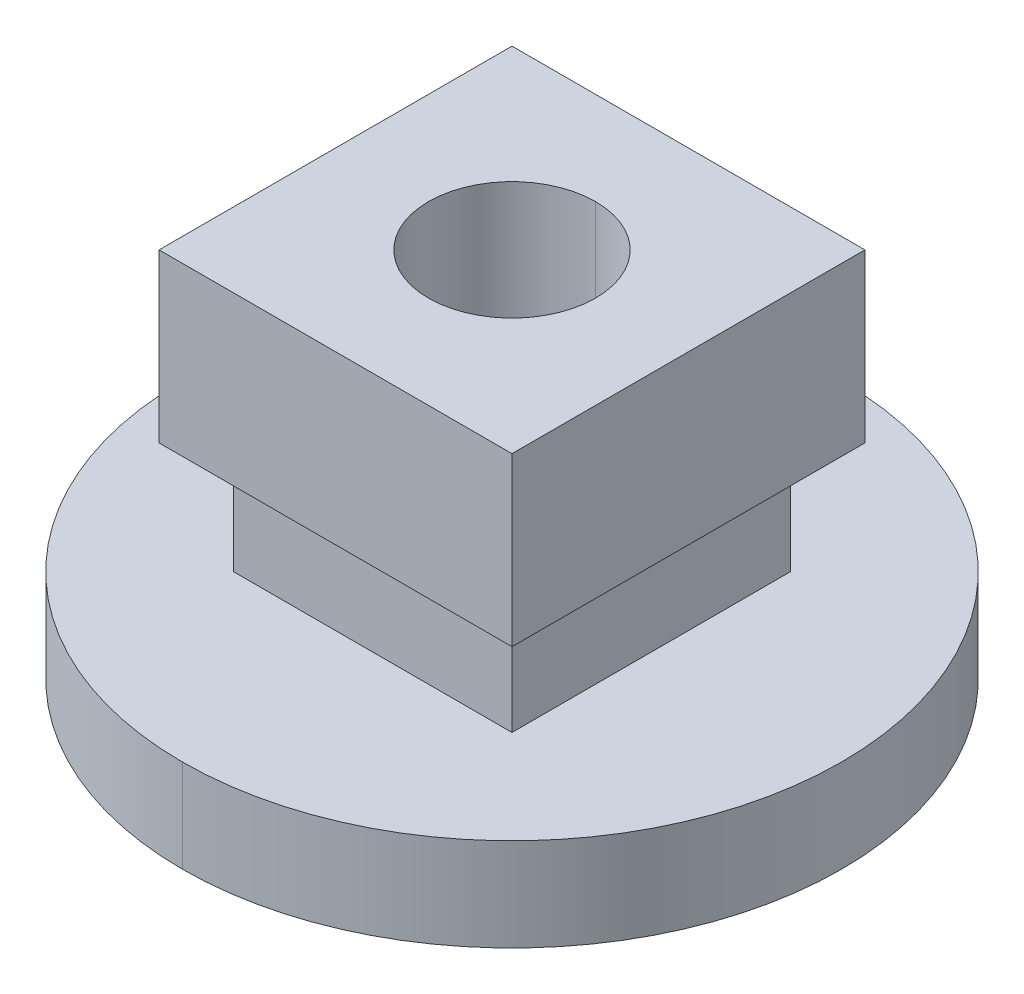
ISO-10303-21;
HEADER;
FILE_DESCRIPTION(('STEP AP214'),'2;1');
FILE_NAME('part.step','',(''),(''),'','','');
FILE_SCHEMA(('AUTOMOTIVE_DESIGN { 1 0 10303 214 1 1 1 1 }'));
ENDSEC;
DATA;
#1=APPLICATION_CONTEXT('core data for automotive mechanical design processes');
#2=APPLICATION_PROTOCOL_DEFINITION('international standard','automotive_design',2000,#1);
#3=PRODUCT_CONTEXT('',#1,'mechanical');
#4=PRODUCT('Part','Part','',(#3));
#5=PRODUCT_RELATED_PRODUCT_CATEGORY('part','',(#4));
#6=PRODUCT_DEFINITION_FORMATION('','',#4);
#7=PRODUCT_DEFINITION_CONTEXT('part definition',#1,'design');
#8=PRODUCT_DEFINITION('design','',#6,#7);
#9=PRODUCT_DEFINITION_SHAPE('','',#8);
#10=(LENGTH_UNIT() NAMED_UNIT(*) SI_UNIT(.MILLI.,.METRE.));
#11=(NAMED_UNIT(*) PLANE_ANGLE_UNIT() SI_UNIT($,.RADIAN.));
#12=(NAMED_UNIT(*) SI_UNIT($,.STERADIAN.) SOLID_ANGLE_UNIT());
#13=UNCERTAINTY_MEASURE_WITH_UNIT(LENGTH_MEASURE(1.E-05),#10,'distance_accuracy_value','');
#14=(GEOMETRIC_REPRESENTATION_CONTEXT(3) GLOBAL_UNCERTAINTY_ASSIGNED_CONTEXT((#13)) GLOBAL_UNIT_ASSIGNED_CONTEXT((#10,
#11,#12)) REPRESENTATION_CONTEXT('',''));
#15=CARTESIAN_POINT('',(0.,0.,0.));
#16=DIRECTION('',(0.,0.,1.));
#17=DIRECTION('',(1.,0.,0.));
#18=AXIS2_PLACEMENT_3D('',#15,#16,#17);
#19=CARTESIAN_POINT('',(0.,-4.,0.));
#20=DIRECTION('',(0.,-1.,0.));
#21=DIRECTION('',(0.,0.,-1.));
#22=AXIS2_PLACEMENT_3D('',#19,#20,#21);
#23=PLANE('',#22);
#24=CARTESIAN_POINT('',(0.,-4.,0.));
#25=DIRECTION('',(0.,-1.,0.));
#26=DIRECTION('',(0.,0.,-1.));
#27=AXIS2_PLACEMENT_3D('',#24,#25,#26);
#28=CIRCLE('',#27,3.55);
#29=CARTESIAN_POINT('',(0.,-4.,3.55));
#30=VERTEX_POINT('',#29);
#31=CARTESIAN_POINT('',(0.,-4.,-3.55));
#32=VERTEX_POINT('',#31);
#33=EDGE_CURVE('E11',#30,#32,#28,.T.);
#34=ORIENTED_EDGE('',*,*,#33,.T.);
#35=CARTESIAN_POINT('',(0.,-4.,0.));
#36=DIRECTION('',(0.,-1.,0.));
#37=DIRECTION('',(0.,0.,-1.));
#38=AXIS2_PLACEMENT_3D('',#35,#36,#37);
#39=CIRCLE('',#38,3.55);
#40=EDGE_CURVE('E205',#32,#30,#39,.T.);
#41=ORIENTED_EDGE('',*,*,#40,.T.);
#42=EDGE_LOOP('',(#34,#41));
#43=FACE_BOUND('',#42,.T.);
#44=ADVANCED_FACE('F17',(#43),#23,.T.);
#45=CARTESIAN_POINT('',(0.,-4.,0.));
#46=DIRECTION('',(0.,1.,0.));
#47=DIRECTION('',(0.,0.,1.));
#48=AXIS2_PLACEMENT_3D('',#45,#46,#47);
#49=CYLINDRICAL_SURFACE('',#48,3.55);
#50=DIRECTION('',(0.,1.,0.));
#51=VECTOR('',#50,1.);
#52=CARTESIAN_POINT('',(0.,-4.,-3.55));
#53=LINE('',#52,#51);
#54=CARTESIAN_POINT('',(0.,-3.,-3.55));
#55=VERTEX_POINT('',#54);
#56=EDGE_CURVE('E202',#32,#55,#53,.T.);
#57=ORIENTED_EDGE('',*,*,#56,.F.);
#58=ORIENTED_EDGE('',*,*,#33,.F.);
#59=DIRECTION('',(0.,1.,0.));
#60=VECTOR('',#59,1.);
#61=CARTESIAN_POINT('',(0.,-4.,3.55));
#62=LINE('',#61,#60);
#63=CARTESIAN_POINT('',(0.,-3.,3.55));
#64=VERTEX_POINT('',#63);
#65=EDGE_CURVE('E25',#30,#64,#62,.T.);
#66=ORIENTED_EDGE('',*,*,#65,.T.);
#67=CARTESIAN_POINT('',(0.,-3.,0.));
#68=DIRECTION('',(0.,-1.,0.));
#69=DIRECTION('',(0.,0.,-1.));
#70=AXIS2_PLACEMENT_3D('',#67,#68,#69);
#71=CIRCLE('',#70,3.55);
#72=EDGE_CURVE('E191',#64,#55,#71,.T.);
#73=ORIENTED_EDGE('',*,*,#72,.T.);
#74=EDGE_LOOP('',(#57,#58,#66,#73));
#75=FACE_BOUND('',#74,.T.);
#76=ADVANCED_FACE('F209',(#75),#49,.T.);
#77=CARTESIAN_POINT('',(0.,-4.,0.));
#78=DIRECTION('',(0.,1.,0.));
#79=DIRECTION('',(0.,0.,1.));
#80=AXIS2_PLACEMENT_3D('',#77,#78,#79);
#81=CYLINDRICAL_SURFACE('',#80,3.55);
#82=ORIENTED_EDGE('',*,*,#40,.F.);
#83=ORIENTED_EDGE('',*,*,#56,.T.);
#84=CARTESIAN_POINT('',(0.,-3.,0.));
#85=DIRECTION('',(0.,-1.,0.));
#86=DIRECTION('',(0.,0.,-1.));
#87=AXIS2_PLACEMENT_3D('',#84,#85,#86);
#88=CIRCLE('',#87,3.55);
#89=EDGE_CURVE('E196',#55,#64,#88,.T.);
#90=ORIENTED_EDGE('',*,*,#89,.T.);
#91=ORIENTED_EDGE('',*,*,#65,.F.);
#92=EDGE_LOOP('',(#82,#83,#90,#91));
#93=FACE_BOUND('',#92,.T.);
#94=ADVANCED_FACE('F214',(#93),#81,.T.);
#95=CARTESIAN_POINT('',(0.,-1.8,0.));
#96=DIRECTION('',(0.,1.,0.));
#97=DIRECTION('',(1.,0.,0.));
#98=AXIS2_PLACEMENT_3D('',#95,#96,#97);
#99=PLANE('',#98);
#100=CARTESIAN_POINT('',(0.,-1.8,0.));
#101=DIRECTION('',(0.,1.,0.));
#102=DIRECTION('',(0.,0.,1.));
#103=AXIS2_PLACEMENT_3D('',#100,#101,#102);
#104=CIRCLE('',#103,0.9);
#105=CARTESIAN_POINT('',(0.,-1.8,0.9));
#106=VERTEX_POINT('',#105);
#107=CARTESIAN_POINT('',(0.,-1.8,-0.9));
#108=VERTEX_POINT('',#107);
#109=EDGE_CURVE('E190',#106,#108,#104,.T.);
#110=ORIENTED_EDGE('',*,*,#109,.T.);
#111=CARTESIAN_POINT('',(0.,-1.8,0.));
#112=DIRECTION('',(0.,1.,0.));
#113=DIRECTION('',(0.,0.,1.));
#114=AXIS2_PLACEMENT_3D('',#111,#112,#113);
#115=CIRCLE('',#114,0.9);
#116=EDGE_CURVE('E192',#108,#106,#115,.T.);
#117=ORIENTED_EDGE('',*,*,#116,.T.);
#118=EDGE_LOOP('',(#110,#117));
#119=FACE_BOUND('',#118,.T.);
#120=ADVANCED_FACE('F217',(#119),#99,.T.);
#121=CARTESIAN_POINT('',(0.,-3.,0.));
#122=DIRECTION('',(0.,-1.,0.));
#123=DIRECTION('',(0.,0.,-1.));
#124=AXIS2_PLACEMENT_3D('',#121,#122,#123);
#125=PLANE('',#124);
#126=DIRECTION('',(1.,0.,0.));
#127=VECTOR('',#126,1.);
#128=CARTESIAN_POINT('',(1.5,-3.,-1.5));
#129=LINE('',#128,#127);
#130=CARTESIAN_POINT('',(-1.5,-3.,-1.5));
#131=VERTEX_POINT('',#130);
#132=CARTESIAN_POINT('',(1.5,-3.,-1.5));
#133=VERTEX_POINT('',#132);
#134=EDGE_CURVE('E146',#131,#133,#129,.T.);
#135=ORIENTED_EDGE('',*,*,#134,.T.);
#136=DIRECTION('',(0.,0.,1.));
#137=VECTOR('',#136,1.);
#138=CARTESIAN_POINT('',(1.5,-3.,1.5));
#139=LINE('',#138,#137);
#140=CARTESIAN_POINT('',(1.5,-3.,1.5));
#141=VERTEX_POINT('',#140);
#142=EDGE_CURVE('E133',#133,#141,#139,.T.);
#143=ORIENTED_EDGE('',*,*,#142,.T.);
#144=DIRECTION('',(-1.,0.,0.));
#145=VECTOR('',#144,1.);
#146=CARTESIAN_POINT('',(1.5,-3.,1.5));
#147=LINE('',#146,#145);
#148=CARTESIAN_POINT('',(-1.5,-3.,1.5));
#149=VERTEX_POINT('',#148);
#150=EDGE_CURVE('E179',#141,#149,#147,.T.);
#151=ORIENTED_EDGE('',*,*,#150,.T.);
#152=DIRECTION('',(0.,0.,-1.));
#153=VECTOR('',#152,1.);
#154=CARTESIAN_POINT('',(-1.5,-3.,1.5));
#155=LINE('',#154,#153);
#156=EDGE_CURVE('E155',#149,#131,#155,.T.);
#157=ORIENTED_EDGE('',*,*,#156,.T.);
#158=EDGE_LOOP('',(#135,#143,#151,#157));
#159=FACE_BOUND('',#158,.T.);
#160=ORIENTED_EDGE('',*,*,#72,.F.);
#161=ORIENTED_EDGE('',*,*,#89,.F.);
#162=EDGE_LOOP('',(#160,#161));
#163=FACE_BOUND('',#162,.T.);
#164=ADVANCED_FACE('F149',(#159,#163),#125,.F.);
#165=CARTESIAN_POINT('',(0.,-1.8,0.));
#166=DIRECTION('',(0.,1.,0.));
#167=DIRECTION('',(0.,0.,1.));
#168=AXIS2_PLACEMENT_3D('',#165,#166,#167);
#169=CYLINDRICAL_SURFACE('',#168,0.9);
#170=ORIENTED_EDGE('',*,*,#116,.F.);
#171=DIRECTION('',(0.,1.,0.));
#172=VECTOR('',#171,1.);
#173=CARTESIAN_POINT('',(0.,-1.8,-0.9));
#174=LINE('',#173,#172);
#175=CARTESIAN_POINT('',(0.,0.,-0.9));
#176=VERTEX_POINT('',#175);
#177=EDGE_CURVE('E144',#108,#176,#174,.T.);
#178=ORIENTED_EDGE('',*,*,#177,.T.);
#179=CARTESIAN_POINT('',(0.,0.,0.));
#180=DIRECTION('',(0.,1.,0.));
#181=DIRECTION('',(0.,0.,1.));
#182=AXIS2_PLACEMENT_3D('',#179,#180,#181);
#183=CIRCLE('',#182,0.9);
#184=CARTESIAN_POINT('',(0.,0.,0.9));
#185=VERTEX_POINT('',#184);
#186=EDGE_CURVE('E162',#176,#185,#183,.T.);
#187=ORIENTED_EDGE('',*,*,#186,.T.);
#188=DIRECTION('',(0.,1.,0.));
#189=VECTOR('',#188,1.);
#190=CARTESIAN_POINT('',(0.,-1.8,0.9));
#191=LINE('',#190,#189);
#192=EDGE_CURVE('E174',#106,#185,#191,.T.);
#193=ORIENTED_EDGE('',*,*,#192,.F.);
#194=EDGE_LOOP('',(#170,#178,#187,#193));
#195=FACE_BOUND('',#194,.T.);
#196=ADVANCED_FACE('F220',(#195),#169,.F.);
#197=CARTESIAN_POINT('',(0.,-1.8,0.));
#198=DIRECTION('',(0.,1.,0.));
#199=DIRECTION('',(0.,0.,1.));
#200=AXIS2_PLACEMENT_3D('',#197,#198,#199);
#201=CYLINDRICAL_SURFACE('',#200,0.9);
#202=ORIENTED_EDGE('',*,*,#177,.F.);
#203=ORIENTED_EDGE('',*,*,#109,.F.);
#204=ORIENTED_EDGE('',*,*,#192,.T.);
#205=CARTESIAN_POINT('',(0.,0.,0.));
#206=DIRECTION('',(0.,1.,0.));
#207=DIRECTION('',(0.,0.,1.));
#208=AXIS2_PLACEMENT_3D('',#205,#206,#207);
#209=CIRCLE('',#208,0.9);
#210=EDGE_CURVE('E168',#185,#176,#209,.T.);
#211=ORIENTED_EDGE('',*,*,#210,.T.);
#212=EDGE_LOOP('',(#202,#203,#204,#211));
#213=FACE_BOUND('',#212,.T.);
#214=ADVANCED_FACE('F226',(#213),#201,.F.);
#215=CARTESIAN_POINT('',(1.5,-3.,1.5));
#216=DIRECTION('',(-1.,0.,0.));
#217=DIRECTION('',(0.,0.,1.));
#218=AXIS2_PLACEMENT_3D('',#215,#216,#217);
#219=PLANE('',#218);
#220=DIRECTION('',(0.,0.,1.));
#221=VECTOR('',#220,1.);
#222=CARTESIAN_POINT('',(1.5,-1.8,1.5));
#223=LINE('',#222,#221);
#224=CARTESIAN_POINT('',(1.5,-1.8,-1.5));
#225=VERTEX_POINT('',#224);
#226=CARTESIAN_POINT('',(1.5,-1.8,1.5));
#227=VERTEX_POINT('',#226);
#228=EDGE_CURVE('E276',#225,#227,#223,.T.);
#229=ORIENTED_EDGE('',*,*,#228,.T.);
#230=DIRECTION('',(0.,1.,0.));
#231=VECTOR('',#230,1.);
#232=CARTESIAN_POINT('',(1.5,-3.,1.5));
#233=LINE('',#232,#231);
#234=EDGE_CURVE('E143',#141,#227,#233,.T.);
#235=ORIENTED_EDGE('',*,*,#234,.F.);
#236=ORIENTED_EDGE('',*,*,#142,.F.);
#237=DIRECTION('',(0.,1.,0.));
#238=VECTOR('',#237,1.);
#239=CARTESIAN_POINT('',(1.5,-3.,-1.5));
#240=LINE('',#239,#238);
#241=EDGE_CURVE('E136',#133,#225,#240,.T.);
#242=ORIENTED_EDGE('',*,*,#241,.T.);
#243=EDGE_LOOP('',(#229,#235,#236,#242));
#244=FACE_BOUND('',#243,.T.);
#245=ADVANCED_FACE('F140',(#244),#219,.F.);
#246=CARTESIAN_POINT('',(1.5,-3.,1.5));
#247=DIRECTION('',(0.,0.,-1.));
#248=DIRECTION('',(0.,-1.,0.));
#249=AXIS2_PLACEMENT_3D('',#246,#247,#248);
#250=PLANE('',#249);
#251=DIRECTION('',(-1.,0.,0.));
#252=VECTOR('',#251,1.);
#253=CARTESIAN_POINT('',(1.5,-1.8,1.5));
#254=LINE('',#253,#252);
#255=CARTESIAN_POINT('',(-1.5,-1.8,1.5));
#256=VERTEX_POINT('',#255);
#257=EDGE_CURVE('E263',#227,#256,#254,.T.);
#258=ORIENTED_EDGE('',*,*,#257,.T.);
#259=DIRECTION('',(0.,1.,0.));
#260=VECTOR('',#259,1.);
#261=CARTESIAN_POINT('',(-1.5,-3.,1.5));
#262=LINE('',#261,#260);
#263=EDGE_CURVE('E177',#149,#256,#262,.T.);
#264=ORIENTED_EDGE('',*,*,#263,.F.);
#265=ORIENTED_EDGE('',*,*,#150,.F.);
#266=ORIENTED_EDGE('',*,*,#234,.T.);
#267=EDGE_LOOP('',(#258,#264,#265,#266));
#268=FACE_BOUND('',#267,.T.);
#269=ADVANCED_FACE('F246',(#268),#250,.F.);
#270=CARTESIAN_POINT('',(-1.5,-3.,1.5));
#271=DIRECTION('',(1.,0.,0.));
#272=DIRECTION('',(0.,0.,1.));
#273=AXIS2_PLACEMENT_3D('',#270,#271,#272);
#274=PLANE('',#273);
#275=DIRECTION('',(0.,0.,-1.));
#276=VECTOR('',#275,1.);
#277=CARTESIAN_POINT('',(-1.5,-1.8,1.5));
#278=LINE('',#277,#276);
#279=CARTESIAN_POINT('',(-1.5,-1.8,-1.5));
#280=VERTEX_POINT('',#279);
#281=EDGE_CURVE('E268',#256,#280,#278,.T.);
#282=ORIENTED_EDGE('',*,*,#281,.T.);
#283=DIRECTION('',(0.,1.,0.));
#284=VECTOR('',#283,1.);
#285=CARTESIAN_POINT('',(-1.5,-3.,-1.5));
#286=LINE('',#285,#284);
#287=EDGE_CURVE('E156',#131,#280,#286,.T.);
#288=ORIENTED_EDGE('',*,*,#287,.F.);
#289=ORIENTED_EDGE('',*,*,#156,.F.);
#290=ORIENTED_EDGE('',*,*,#263,.T.);
#291=EDGE_LOOP('',(#282,#288,#289,#290));
#292=FACE_BOUND('',#291,.T.);
#293=ADVANCED_FACE('F249',(#292),#274,.F.);
#294=CARTESIAN_POINT('',(1.5,-3.,-1.5));
#295=DIRECTION('',(0.,0.,1.));
#296=DIRECTION('',(1.,0.,0.));
#297=AXIS2_PLACEMENT_3D('',#294,#295,#296);
#298=PLANE('',#297);
#299=DIRECTION('',(1.,0.,0.));
#300=VECTOR('',#299,1.);
#301=CARTESIAN_POINT('',(1.5,-1.8,-1.5));
#302=LINE('',#301,#300);
#303=EDGE_CURVE('E159',#280,#225,#302,.T.);
#304=ORIENTED_EDGE('',*,*,#303,.T.);
#305=ORIENTED_EDGE('',*,*,#241,.F.);
#306=ORIENTED_EDGE('',*,*,#134,.F.);
#307=ORIENTED_EDGE('',*,*,#287,.T.);
#308=EDGE_LOOP('',(#304,#305,#306,#307));
#309=FACE_BOUND('',#308,.T.);
#310=ADVANCED_FACE('F158',(#309),#298,.F.);
#311=CARTESIAN_POINT('',(-1.9,-1.8,-1.9));
#312=DIRECTION('',(-1.,0.,0.));
#313=DIRECTION('',(0.,0.,1.));
#314=AXIS2_PLACEMENT_3D('',#311,#312,#313);
#315=PLANE('',#314);
#316=DIRECTION('',(0.,0.,1.));
#317=VECTOR('',#316,1.);
#318=CARTESIAN_POINT('',(-1.9,0.,-1.9));
#319=LINE('',#318,#317);
#320=CARTESIAN_POINT('',(-1.9,0.,-1.9));
#321=VERTEX_POINT('',#320);
#322=CARTESIAN_POINT('',(-1.9,0.,1.9));
#323=VERTEX_POINT('',#322);
#324=EDGE_CURVE('E270',#321,#323,#319,.T.);
#325=ORIENTED_EDGE('',*,*,#324,.F.);
#326=DIRECTION('',(0.,1.,0.));
#327=VECTOR('',#326,1.);
#328=CARTESIAN_POINT('',(-1.9,-1.8,-1.9));
#329=LINE('',#328,#327);
#330=CARTESIAN_POINT('',(-1.9,-1.8,-1.9));
#331=VERTEX_POINT('',#330);
#332=EDGE_CURVE('E319',#331,#321,#329,.T.);
#333=ORIENTED_EDGE('',*,*,#332,.F.);
#334=DIRECTION('',(0.,0.,1.));
#335=VECTOR('',#334,1.);
#336=CARTESIAN_POINT('',(-1.9,-1.8,-1.9));
#337=LINE('',#336,#335);
#338=CARTESIAN_POINT('',(-1.9,-1.8,1.9));
#339=VERTEX_POINT('',#338);
#340=EDGE_CURVE('E327',#331,#339,#337,.T.);
#341=ORIENTED_EDGE('',*,*,#340,.T.);
#342=DIRECTION('',(0.,1.,0.));
#343=VECTOR('',#342,1.);
#344=CARTESIAN_POINT('',(-1.9,-1.8,1.9));
#345=LINE('',#344,#343);
#346=EDGE_CURVE('E342',#339,#323,#345,.T.);
#347=ORIENTED_EDGE('',*,*,#346,.T.);
#348=EDGE_LOOP('',(#325,#333,#341,#347));
#349=FACE_BOUND('',#348,.T.);
#350=ADVANCED_FACE('F250',(#349),#315,.T.);
#351=CARTESIAN_POINT('',(-1.9,0.,1.9));
#352=DIRECTION('',(0.,1.,0.));
#353=DIRECTION('',(1.,0.,0.));
#354=AXIS2_PLACEMENT_3D('',#351,#352,#353);
#355=PLANE('',#354);
#356=ORIENTED_EDGE('',*,*,#210,.F.);
#357=ORIENTED_EDGE('',*,*,#186,.F.);
#358=EDGE_LOOP('',(#356,#357));
#359=FACE_BOUND('',#358,.T.);
#360=ORIENTED_EDGE('',*,*,#324,.T.);
#361=DIRECTION('',(1.,0.,0.));
#362=VECTOR('',#361,1.);
#363=CARTESIAN_POINT('',(-1.9,0.,1.9));
#364=LINE('',#363,#362);
#365=CARTESIAN_POINT('',(1.9,0.,1.9));
#366=VERTEX_POINT('',#365);
#367=EDGE_CURVE('E322',#323,#366,#364,.T.);
#368=ORIENTED_EDGE('',*,*,#367,.T.);
#369=DIRECTION('',(0.,0.,-1.));
#370=VECTOR('',#369,1.);
#371=CARTESIAN_POINT('',(1.9,0.,-1.9));
#372=LINE('',#371,#370);
#373=CARTESIAN_POINT('',(1.9,0.,-1.9));
#374=VERTEX_POINT('',#373);
#375=EDGE_CURVE('E394',#366,#374,#372,.T.);
#376=ORIENTED_EDGE('',*,*,#375,.T.);
#377=DIRECTION('',(-1.,0.,0.));
#378=VECTOR('',#377,1.);
#379=CARTESIAN_POINT('',(-1.9,0.,-1.9));
#380=LINE('',#379,#378);
#381=EDGE_CURVE('E339',#374,#321,#380,.T.);
#382=ORIENTED_EDGE('',*,*,#381,.T.);
#383=EDGE_LOOP('',(#360,#368,#376,#382));
#384=FACE_BOUND('',#383,.T.);
#385=ADVANCED_FACE('F292',(#359,#384),#355,.T.);
#386=CARTESIAN_POINT('',(-1.9,-1.8,1.9));
#387=DIRECTION('',(0.,1.,0.));
#388=DIRECTION('',(1.,0.,0.));
#389=AXIS2_PLACEMENT_3D('',#386,#387,#388);
#390=PLANE('',#389);
#391=ORIENTED_EDGE('',*,*,#228,.F.);
#392=ORIENTED_EDGE('',*,*,#303,.F.);
#393=ORIENTED_EDGE('',*,*,#281,.F.);
#394=ORIENTED_EDGE('',*,*,#257,.F.);
#395=EDGE_LOOP('',(#391,#392,#393,#394));
#396=FACE_BOUND('',#395,.T.);
#397=ORIENTED_EDGE('',*,*,#340,.F.);
#398=DIRECTION('',(-1.,0.,0.));
#399=VECTOR('',#398,1.);
#400=CARTESIAN_POINT('',(-1.9,-1.8,-1.9));
#401=LINE('',#400,#399);
#402=CARTESIAN_POINT('',(1.9,-1.8,-1.9));
#403=VERTEX_POINT('',#402);
#404=EDGE_CURVE('E324',#403,#331,#401,.T.);
#405=ORIENTED_EDGE('',*,*,#404,.F.);
#406=DIRECTION('',(0.,0.,-1.));
#407=VECTOR('',#406,1.);
#408=CARTESIAN_POINT('',(1.9,-1.8,-1.9));
#409=LINE('',#408,#407);
#410=CARTESIAN_POINT('',(1.9,-1.8,1.9));
#411=VERTEX_POINT('',#410);
#412=EDGE_CURVE('E355',#411,#403,#409,.T.);
#413=ORIENTED_EDGE('',*,*,#412,.F.);
#414=DIRECTION('',(1.,0.,0.));
#415=VECTOR('',#414,1.);
#416=CARTESIAN_POINT('',(-1.9,-1.8,1.9));
#417=LINE('',#416,#415);
#418=EDGE_CURVE('E332',#339,#411,#417,.T.);
#419=ORIENTED_EDGE('',*,*,#418,.F.);
#420=EDGE_LOOP('',(#397,#405,#413,#419));
#421=FACE_BOUND('',#420,.T.);
#422=ADVANCED_FACE('F271',(#396,#421),#390,.F.);
#423=CARTESIAN_POINT('',(-1.9,-1.8,1.9));
#424=DIRECTION('',(0.,0.,1.));
#425=DIRECTION('',(1.,0.,0.));
#426=AXIS2_PLACEMENT_3D('',#423,#424,#425);
#427=PLANE('',#426);
#428=ORIENTED_EDGE('',*,*,#367,.F.);
#429=ORIENTED_EDGE('',*,*,#346,.F.);
#430=ORIENTED_EDGE('',*,*,#418,.T.);
#431=DIRECTION('',(0.,1.,0.));
#432=VECTOR('',#431,1.);
#433=CARTESIAN_POINT('',(1.9,-1.8,1.9));
#434=LINE('',#433,#432);
#435=EDGE_CURVE('E367',#411,#366,#434,.T.);
#436=ORIENTED_EDGE('',*,*,#435,.T.);
#437=EDGE_LOOP('',(#428,#429,#430,#436));
#438=FACE_BOUND('',#437,.T.);
#439=ADVANCED_FACE('F413',(#438),#427,.T.);
#440=CARTESIAN_POINT('',(-1.9,-1.8,-1.9));
#441=DIRECTION('',(0.,0.,-1.));
#442=DIRECTION('',(0.,-1.,0.));
#443=AXIS2_PLACEMENT_3D('',#440,#441,#442);
#444=PLANE('',#443);
#445=ORIENTED_EDGE('',*,*,#381,.F.);
#446=DIRECTION('',(0.,1.,0.));
#447=VECTOR('',#446,1.);
#448=CARTESIAN_POINT('',(1.9,-1.8,-1.9));
#449=LINE('',#448,#447);
#450=EDGE_CURVE('E348',#403,#374,#449,.T.);
#451=ORIENTED_EDGE('',*,*,#450,.F.);
#452=ORIENTED_EDGE('',*,*,#404,.T.);
#453=ORIENTED_EDGE('',*,*,#332,.T.);
#454=EDGE_LOOP('',(#445,#451,#452,#453));
#455=FACE_BOUND('',#454,.T.);
#456=ADVANCED_FACE('F408',(#455),#444,.T.);
#457=CARTESIAN_POINT('',(1.9,-1.8,-1.9));
#458=DIRECTION('',(1.,0.,0.));
#459=DIRECTION('',(0.,1.,0.));
#460=AXIS2_PLACEMENT_3D('',#457,#458,#459);
#461=PLANE('',#460);
#462=ORIENTED_EDGE('',*,*,#375,.F.);
#463=ORIENTED_EDGE('',*,*,#435,.F.);
#464=ORIENTED_EDGE('',*,*,#412,.T.);
#465=ORIENTED_EDGE('',*,*,#450,.T.);
#466=EDGE_LOOP('',(#462,#463,#464,#465));
#467=FACE_BOUND('',#466,.T.);
#468=ADVANCED_FACE('F404',(#467),#461,.T.);
#469=CLOSED_SHELL('',(#44,#76,#94,#120,#164,#196,#214,#245,#269,#293,#310,#350,#385,#422,#439,
#456,#468));
#470=MANIFOLD_SOLID_BREP('B1',#469);
#471=ADVANCED_BREP_SHAPE_REPRESENTATION('',(#18,#470),#14);
#472=SHAPE_DEFINITION_REPRESENTATION(#9,#471);
ENDSEC;
END-ISO-10303-21;
